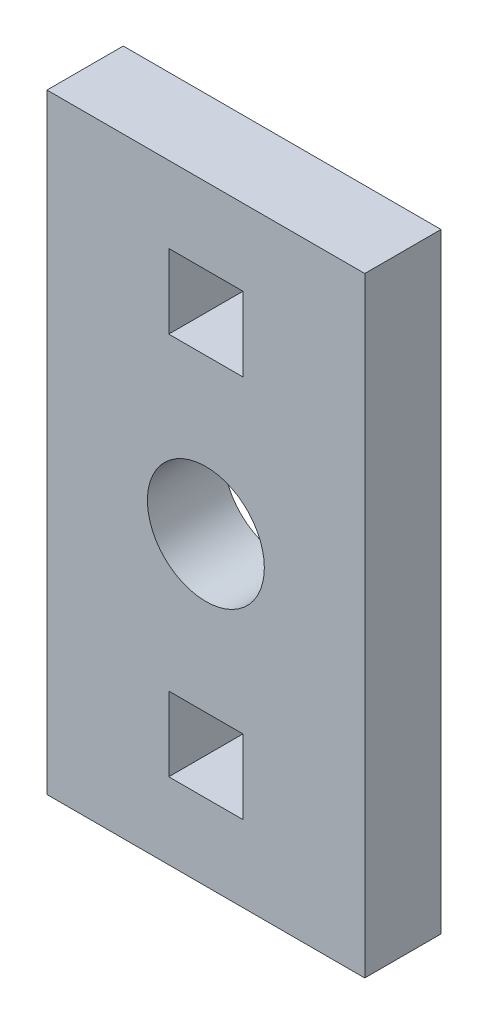
ISO-10303-21;
HEADER;
FILE_DESCRIPTION(('STEP AP214'),'2;1');
FILE_NAME('part.step','',(''),(''),'','','');
FILE_SCHEMA(('AUTOMOTIVE_DESIGN { 1 0 10303 214 1 1 1 1 }'));
ENDSEC;
DATA;
#1=APPLICATION_CONTEXT('core data for automotive mechanical design processes');
#2=APPLICATION_PROTOCOL_DEFINITION('international standard','automotive_design',2000,#1);
#3=PRODUCT_CONTEXT('',#1,'mechanical');
#4=PRODUCT('Part','Part','',(#3));
#5=PRODUCT_RELATED_PRODUCT_CATEGORY('part','',(#4));
#6=PRODUCT_DEFINITION_FORMATION('','',#4);
#7=PRODUCT_DEFINITION_CONTEXT('part definition',#1,'design');
#8=PRODUCT_DEFINITION('design','',#6,#7);
#9=PRODUCT_DEFINITION_SHAPE('','',#8);
#10=(LENGTH_UNIT() NAMED_UNIT(*) SI_UNIT(.MILLI.,.METRE.));
#11=(NAMED_UNIT(*) PLANE_ANGLE_UNIT() SI_UNIT($,.RADIAN.));
#12=(NAMED_UNIT(*) SI_UNIT($,.STERADIAN.) SOLID_ANGLE_UNIT());
#13=UNCERTAINTY_MEASURE_WITH_UNIT(LENGTH_MEASURE(1.E-05),#10,'distance_accuracy_value','');
#14=(GEOMETRIC_REPRESENTATION_CONTEXT(3) GLOBAL_UNCERTAINTY_ASSIGNED_CONTEXT((#13)) GLOBAL_UNIT_ASSIGNED_CONTEXT((#10,
#11,#12)) REPRESENTATION_CONTEXT('',''));
#15=CARTESIAN_POINT('',(0.,0.,0.));
#16=DIRECTION('',(0.,0.,1.));
#17=DIRECTION('',(1.,0.,0.));
#18=AXIS2_PLACEMENT_3D('',#15,#16,#17);
#19=CARTESIAN_POINT('',(0.,0.,3.));
#20=DIRECTION('',(0.,0.,1.));
#21=DIRECTION('',(1.,0.,0.));
#22=AXIS2_PLACEMENT_3D('',#19,#20,#21);
#23=PLANE('',#22);
#24=DIRECTION('',(0.,-1.,0.));
#25=VECTOR('',#24,1.);
#26=CARTESIAN_POINT('',(-10.4166666666667,7.90441176470589,3.));
#27=LINE('',#26,#25);
#28=CARTESIAN_POINT('',(-10.4166666666667,7.90441176470589,3.));
#29=VERTEX_POINT('',#28);
#30=CARTESIAN_POINT('',(-10.4166666666667,-16.0955882352941,3.));
#31=VERTEX_POINT('',#30);
#32=EDGE_CURVE('E194',#29,#31,#27,.T.);
#33=ORIENTED_EDGE('',*,*,#32,.T.);
#34=DIRECTION('',(1.,0.,0.));
#35=VECTOR('',#34,1.);
#36=CARTESIAN_POINT('',(-10.4166666666667,-16.0955882352941,3.));
#37=LINE('',#36,#35);
#38=CARTESIAN_POINT('',(2.08333333333333,-16.0955882352941,3.));
#39=VERTEX_POINT('',#38);
#40=EDGE_CURVE('E197',#31,#39,#37,.T.);
#41=ORIENTED_EDGE('',*,*,#40,.T.);
#42=DIRECTION('',(0.,1.,0.));
#43=VECTOR('',#42,1.);
#44=CARTESIAN_POINT('',(2.08333333333333,7.90441176470589,3.));
#45=LINE('',#44,#43);
#46=CARTESIAN_POINT('',(2.08333333333333,7.90441176470589,3.));
#47=VERTEX_POINT('',#46);
#48=EDGE_CURVE('E200',#39,#47,#45,.T.);
#49=ORIENTED_EDGE('',*,*,#48,.T.);
#50=DIRECTION('',(-1.,0.,0.));
#51=VECTOR('',#50,1.);
#52=CARTESIAN_POINT('',(-10.4166666666667,7.90441176470589,3.));
#53=LINE('',#52,#51);
#54=EDGE_CURVE('E202',#47,#29,#53,.T.);
#55=ORIENTED_EDGE('',*,*,#54,.T.);
#56=EDGE_LOOP('',(#33,#41,#49,#55));
#57=FACE_BOUND('',#56,.T.);
#58=CARTESIAN_POINT('',(-4.16666666666667,-4.09558823529412,3.));
#59=DIRECTION('',(0.,0.,1.));
#60=DIRECTION('',(1.,0.,0.));
#61=AXIS2_PLACEMENT_3D('',#58,#59,#60);
#62=CIRCLE('',#61,2.3);
#63=CARTESIAN_POINT('',(-1.86666666666667,-4.09558823529412,3.));
#64=VERTEX_POINT('',#63);
#65=EDGE_CURVE('E188',#64,#64,#62,.T.);
#66=ORIENTED_EDGE('',*,*,#65,.F.);
#67=EDGE_LOOP('',(#66));
#68=FACE_BOUND('',#67,.T.);
#69=DIRECTION('',(1.,0.,0.));
#70=VECTOR('',#69,1.);
#71=CARTESIAN_POINT('',(-5.62666666666667,1.98441176470589,3.));
#72=LINE('',#71,#70);
#73=CARTESIAN_POINT('',(-5.62666666666667,1.98441176470589,3.));
#74=VERTEX_POINT('',#73);
#75=CARTESIAN_POINT('',(-2.70666666666667,1.98441176470589,3.));
#76=VERTEX_POINT('',#75);
#77=EDGE_CURVE('E159',#74,#76,#72,.T.);
#78=ORIENTED_EDGE('',*,*,#77,.F.);
#79=DIRECTION('',(0.,-1.,0.));
#80=VECTOR('',#79,1.);
#81=CARTESIAN_POINT('',(-5.62666666666667,4.90441176470589,3.));
#82=LINE('',#81,#80);
#83=CARTESIAN_POINT('',(-5.62666666666667,4.90441176470589,3.));
#84=VERTEX_POINT('',#83);
#85=EDGE_CURVE('E157',#84,#74,#82,.T.);
#86=ORIENTED_EDGE('',*,*,#85,.F.);
#87=DIRECTION('',(-1.,0.,0.));
#88=VECTOR('',#87,1.);
#89=CARTESIAN_POINT('',(-5.62666666666667,4.90441176470589,3.));
#90=LINE('',#89,#88);
#91=CARTESIAN_POINT('',(-2.70666666666667,4.90441176470589,3.));
#92=VERTEX_POINT('',#91);
#93=EDGE_CURVE('E165',#92,#84,#90,.T.);
#94=ORIENTED_EDGE('',*,*,#93,.F.);
#95=DIRECTION('',(0.,1.,0.));
#96=VECTOR('',#95,1.);
#97=CARTESIAN_POINT('',(-2.70666666666667,4.90441176470589,3.));
#98=LINE('',#97,#96);
#99=EDGE_CURVE('E162',#76,#92,#98,.T.);
#100=ORIENTED_EDGE('',*,*,#99,.F.);
#101=EDGE_LOOP('',(#78,#86,#94,#100));
#102=FACE_BOUND('',#101,.T.);
#103=DIRECTION('',(0.,1.,0.));
#104=VECTOR('',#103,1.);
#105=CARTESIAN_POINT('',(-2.70666666666667,-13.0955882352941,3.));
#106=LINE('',#105,#104);
#107=CARTESIAN_POINT('',(-2.70666666666667,-13.0955882352941,3.));
#108=VERTEX_POINT('',#107);
#109=CARTESIAN_POINT('',(-2.70666666666667,-10.1755882352941,3.));
#110=VERTEX_POINT('',#109);
#111=EDGE_CURVE('E129',#108,#110,#106,.T.);
#112=ORIENTED_EDGE('',*,*,#111,.F.);
#113=DIRECTION('',(1.,0.,0.));
#114=VECTOR('',#113,1.);
#115=CARTESIAN_POINT('',(-5.62666666666667,-13.0955882352941,3.));
#116=LINE('',#115,#114);
#117=CARTESIAN_POINT('',(-5.62666666666667,-13.0955882352941,3.));
#118=VERTEX_POINT('',#117);
#119=EDGE_CURVE('E121',#118,#108,#116,.T.);
#120=ORIENTED_EDGE('',*,*,#119,.F.);
#121=DIRECTION('',(0.,-1.,0.));
#122=VECTOR('',#121,1.);
#123=CARTESIAN_POINT('',(-5.62666666666667,-13.0955882352941,3.));
#124=LINE('',#123,#122);
#125=CARTESIAN_POINT('',(-5.62666666666667,-10.1755882352941,3.));
#126=VERTEX_POINT('',#125);
#127=EDGE_CURVE('E143',#126,#118,#124,.T.);
#128=ORIENTED_EDGE('',*,*,#127,.F.);
#129=DIRECTION('',(-1.,0.,0.));
#130=VECTOR('',#129,1.);
#131=CARTESIAN_POINT('',(-5.62666666666667,-10.1755882352941,3.));
#132=LINE('',#131,#130);
#133=EDGE_CURVE('E141',#110,#126,#132,.T.);
#134=ORIENTED_EDGE('',*,*,#133,.F.);
#135=EDGE_LOOP('',(#112,#120,#128,#134));
#136=FACE_BOUND('',#135,.T.);
#137=ADVANCED_FACE('F32',(#57,#68,#102,#136),#23,.T.);
#138=CARTESIAN_POINT('',(0.,0.,0.));
#139=DIRECTION('',(0.,0.,1.));
#140=DIRECTION('',(1.,0.,0.));
#141=AXIS2_PLACEMENT_3D('',#138,#139,#140);
#142=PLANE('',#141);
#143=DIRECTION('',(0.,-1.,0.));
#144=VECTOR('',#143,1.);
#145=CARTESIAN_POINT('',(-5.62666666666667,4.90441176470589,0.));
#146=LINE('',#145,#144);
#147=CARTESIAN_POINT('',(-5.62666666666667,4.90441176470589,0.));
#148=VERTEX_POINT('',#147);
#149=CARTESIAN_POINT('',(-5.62666666666667,1.98441176470589,0.));
#150=VERTEX_POINT('',#149);
#151=EDGE_CURVE('E137',#148,#150,#146,.T.);
#152=ORIENTED_EDGE('',*,*,#151,.T.);
#153=DIRECTION('',(1.,0.,0.));
#154=VECTOR('',#153,1.);
#155=CARTESIAN_POINT('',(-5.62666666666667,1.98441176470589,0.));
#156=LINE('',#155,#154);
#157=CARTESIAN_POINT('',(-2.70666666666667,1.98441176470589,0.));
#158=VERTEX_POINT('',#157);
#159=EDGE_CURVE('E170',#150,#158,#156,.T.);
#160=ORIENTED_EDGE('',*,*,#159,.T.);
#161=DIRECTION('',(0.,1.,0.));
#162=VECTOR('',#161,1.);
#163=CARTESIAN_POINT('',(-2.70666666666667,4.90441176470589,0.));
#164=LINE('',#163,#162);
#165=CARTESIAN_POINT('',(-2.70666666666667,4.90441176470589,0.));
#166=VERTEX_POINT('',#165);
#167=EDGE_CURVE('E173',#158,#166,#164,.T.);
#168=ORIENTED_EDGE('',*,*,#167,.T.);
#169=DIRECTION('',(-1.,0.,0.));
#170=VECTOR('',#169,1.);
#171=CARTESIAN_POINT('',(-5.62666666666667,4.90441176470589,0.));
#172=LINE('',#171,#170);
#173=EDGE_CURVE('E160',#166,#148,#172,.T.);
#174=ORIENTED_EDGE('',*,*,#173,.T.);
#175=EDGE_LOOP('',(#152,#160,#168,#174));
#176=FACE_BOUND('',#175,.T.);
#177=DIRECTION('',(0.,-1.,0.));
#178=VECTOR('',#177,1.);
#179=CARTESIAN_POINT('',(-10.4166666666667,7.90441176470589,0.));
#180=LINE('',#179,#178);
#181=CARTESIAN_POINT('',(-10.4166666666667,7.90441176470589,0.));
#182=VERTEX_POINT('',#181);
#183=CARTESIAN_POINT('',(-10.4166666666667,-16.0955882352941,0.));
#184=VERTEX_POINT('',#183);
#185=EDGE_CURVE('E191',#182,#184,#180,.T.);
#186=ORIENTED_EDGE('',*,*,#185,.F.);
#187=DIRECTION('',(-1.,0.,0.));
#188=VECTOR('',#187,1.);
#189=CARTESIAN_POINT('',(-10.4166666666667,7.90441176470589,0.));
#190=LINE('',#189,#188);
#191=CARTESIAN_POINT('',(2.08333333333333,7.90441176470589,0.));
#192=VERTEX_POINT('',#191);
#193=EDGE_CURVE('E198',#192,#182,#190,.T.);
#194=ORIENTED_EDGE('',*,*,#193,.F.);
#195=DIRECTION('',(0.,1.,0.));
#196=VECTOR('',#195,1.);
#197=CARTESIAN_POINT('',(2.08333333333333,7.90441176470589,0.));
#198=LINE('',#197,#196);
#199=CARTESIAN_POINT('',(2.08333333333333,-16.0955882352941,0.));
#200=VERTEX_POINT('',#199);
#201=EDGE_CURVE('E209',#200,#192,#198,.T.);
#202=ORIENTED_EDGE('',*,*,#201,.F.);
#203=DIRECTION('',(1.,0.,0.));
#204=VECTOR('',#203,1.);
#205=CARTESIAN_POINT('',(-10.4166666666667,-16.0955882352941,0.));
#206=LINE('',#205,#204);
#207=EDGE_CURVE('E207',#184,#200,#206,.T.);
#208=ORIENTED_EDGE('',*,*,#207,.F.);
#209=EDGE_LOOP('',(#186,#194,#202,#208));
#210=FACE_BOUND('',#209,.T.);
#211=CARTESIAN_POINT('',(-4.16666666666667,-4.09558823529412,0.));
#212=DIRECTION('',(0.,0.,1.));
#213=DIRECTION('',(1.,0.,0.));
#214=AXIS2_PLACEMENT_3D('',#211,#212,#213);
#215=CIRCLE('',#214,2.3);
#216=CARTESIAN_POINT('',(-1.86666666666667,-4.09558823529412,0.));
#217=VERTEX_POINT('',#216);
#218=EDGE_CURVE('E187',#217,#217,#215,.T.);
#219=ORIENTED_EDGE('',*,*,#218,.T.);
#220=EDGE_LOOP('',(#219));
#221=FACE_BOUND('',#220,.T.);
#222=DIRECTION('',(1.,0.,0.));
#223=VECTOR('',#222,1.);
#224=CARTESIAN_POINT('',(-5.62666666666667,-13.0955882352941,0.));
#225=LINE('',#224,#223);
#226=CARTESIAN_POINT('',(-5.62666666666667,-13.0955882352941,0.));
#227=VERTEX_POINT('',#226);
#228=CARTESIAN_POINT('',(-2.70666666666667,-13.0955882352941,0.));
#229=VERTEX_POINT('',#228);
#230=EDGE_CURVE('E55',#227,#229,#225,.T.);
#231=ORIENTED_EDGE('',*,*,#230,.T.);
#232=DIRECTION('',(0.,1.,0.));
#233=VECTOR('',#232,1.);
#234=CARTESIAN_POINT('',(-2.70666666666667,-13.0955882352941,0.));
#235=LINE('',#234,#233);
#236=CARTESIAN_POINT('',(-2.70666666666667,-10.1755882352941,0.));
#237=VERTEX_POINT('',#236);
#238=EDGE_CURVE('E136',#229,#237,#235,.T.);
#239=ORIENTED_EDGE('',*,*,#238,.T.);
#240=DIRECTION('',(-1.,0.,0.));
#241=VECTOR('',#240,1.);
#242=CARTESIAN_POINT('',(-5.62666666666667,-10.1755882352941,0.));
#243=LINE('',#242,#241);
#244=CARTESIAN_POINT('',(-5.62666666666667,-10.1755882352941,0.));
#245=VERTEX_POINT('',#244);
#246=EDGE_CURVE('E149',#237,#245,#243,.T.);
#247=ORIENTED_EDGE('',*,*,#246,.T.);
#248=DIRECTION('',(0.,-1.,0.));
#249=VECTOR('',#248,1.);
#250=CARTESIAN_POINT('',(-5.62666666666667,-13.0955882352941,0.));
#251=LINE('',#250,#249);
#252=EDGE_CURVE('E130',#245,#227,#251,.T.);
#253=ORIENTED_EDGE('',*,*,#252,.T.);
#254=EDGE_LOOP('',(#231,#239,#247,#253));
#255=FACE_BOUND('',#254,.T.);
#256=ADVANCED_FACE('F227',(#176,#210,#221,#255),#142,.F.);
#257=CARTESIAN_POINT('',(-10.4166666666667,7.90441176470589,3.));
#258=DIRECTION('',(1.,0.,0.));
#259=DIRECTION('',(0.,1.,0.));
#260=AXIS2_PLACEMENT_3D('',#257,#258,#259);
#261=PLANE('',#260);
#262=ORIENTED_EDGE('',*,*,#185,.T.);
#263=DIRECTION('',(0.,0.,-1.));
#264=VECTOR('',#263,1.);
#265=CARTESIAN_POINT('',(-10.4166666666667,-16.0955882352941,3.));
#266=LINE('',#265,#264);
#267=EDGE_CURVE('E11',#31,#184,#266,.T.);
#268=ORIENTED_EDGE('',*,*,#267,.F.);
#269=ORIENTED_EDGE('',*,*,#32,.F.);
#270=DIRECTION('',(0.,0.,-1.));
#271=VECTOR('',#270,1.);
#272=CARTESIAN_POINT('',(-10.4166666666667,7.90441176470589,3.));
#273=LINE('',#272,#271);
#274=EDGE_CURVE('E204',#29,#182,#273,.T.);
#275=ORIENTED_EDGE('',*,*,#274,.T.);
#276=EDGE_LOOP('',(#262,#268,#269,#275));
#277=FACE_BOUND('',#276,.T.);
#278=ADVANCED_FACE('F34',(#277),#261,.F.);
#279=CARTESIAN_POINT('',(-10.4166666666667,-16.0955882352941,3.));
#280=DIRECTION('',(0.,1.,0.));
#281=DIRECTION('',(0.,0.,1.));
#282=AXIS2_PLACEMENT_3D('',#279,#280,#281);
#283=PLANE('',#282);
#284=ORIENTED_EDGE('',*,*,#207,.T.);
#285=DIRECTION('',(0.,0.,-1.));
#286=VECTOR('',#285,1.);
#287=CARTESIAN_POINT('',(2.08333333333333,-16.0955882352941,3.));
#288=LINE('',#287,#286);
#289=EDGE_CURVE('E40',#39,#200,#288,.T.);
#290=ORIENTED_EDGE('',*,*,#289,.F.);
#291=ORIENTED_EDGE('',*,*,#40,.F.);
#292=ORIENTED_EDGE('',*,*,#267,.T.);
#293=EDGE_LOOP('',(#284,#290,#291,#292));
#294=FACE_BOUND('',#293,.T.);
#295=ADVANCED_FACE('F238',(#294),#283,.F.);
#296=CARTESIAN_POINT('',(2.08333333333333,7.90441176470589,3.));
#297=DIRECTION('',(-1.,0.,0.));
#298=DIRECTION('',(0.,-1.,0.));
#299=AXIS2_PLACEMENT_3D('',#296,#297,#298);
#300=PLANE('',#299);
#301=ORIENTED_EDGE('',*,*,#201,.T.);
#302=DIRECTION('',(0.,0.,-1.));
#303=VECTOR('',#302,1.);
#304=CARTESIAN_POINT('',(2.08333333333333,7.90441176470589,3.));
#305=LINE('',#304,#303);
#306=EDGE_CURVE('E214',#47,#192,#305,.T.);
#307=ORIENTED_EDGE('',*,*,#306,.F.);
#308=ORIENTED_EDGE('',*,*,#48,.F.);
#309=ORIENTED_EDGE('',*,*,#289,.T.);
#310=EDGE_LOOP('',(#301,#307,#308,#309));
#311=FACE_BOUND('',#310,.T.);
#312=ADVANCED_FACE('F221',(#311),#300,.F.);
#313=CARTESIAN_POINT('',(-10.4166666666667,7.90441176470589,3.));
#314=DIRECTION('',(0.,-1.,0.));
#315=DIRECTION('',(0.,0.,-1.));
#316=AXIS2_PLACEMENT_3D('',#313,#314,#315);
#317=PLANE('',#316);
#318=ORIENTED_EDGE('',*,*,#193,.T.);
#319=ORIENTED_EDGE('',*,*,#274,.F.);
#320=ORIENTED_EDGE('',*,*,#54,.F.);
#321=ORIENTED_EDGE('',*,*,#306,.T.);
#322=EDGE_LOOP('',(#318,#319,#320,#321));
#323=FACE_BOUND('',#322,.T.);
#324=ADVANCED_FACE('F231',(#323),#317,.F.);
#325=CARTESIAN_POINT('',(-4.16666666666667,-4.09558823529412,3.));
#326=DIRECTION('',(0.,0.,-1.));
#327=DIRECTION('',(-1.,0.,0.));
#328=AXIS2_PLACEMENT_3D('',#325,#326,#327);
#329=CYLINDRICAL_SURFACE('',#328,2.3);
#330=ORIENTED_EDGE('',*,*,#65,.T.);
#331=EDGE_LOOP('',(#330));
#332=FACE_BOUND('',#331,.T.);
#333=ORIENTED_EDGE('',*,*,#218,.F.);
#334=EDGE_LOOP('',(#333));
#335=FACE_BOUND('',#334,.T.);
#336=ADVANCED_FACE('F253',(#332,#335),#329,.F.);
#337=CARTESIAN_POINT('',(-5.62666666666667,4.90441176470589,3.));
#338=DIRECTION('',(1.,0.,0.));
#339=DIRECTION('',(0.,1.,0.));
#340=AXIS2_PLACEMENT_3D('',#337,#338,#339);
#341=PLANE('',#340);
#342=ORIENTED_EDGE('',*,*,#151,.F.);
#343=DIRECTION('',(0.,0.,-1.));
#344=VECTOR('',#343,1.);
#345=CARTESIAN_POINT('',(-5.62666666666667,4.90441176470589,3.));
#346=LINE('',#345,#344);
#347=EDGE_CURVE('E167',#84,#148,#346,.T.);
#348=ORIENTED_EDGE('',*,*,#347,.F.);
#349=ORIENTED_EDGE('',*,*,#85,.T.);
#350=DIRECTION('',(0.,0.,-1.));
#351=VECTOR('',#350,1.);
#352=CARTESIAN_POINT('',(-5.62666666666667,1.98441176470589,3.));
#353=LINE('',#352,#351);
#354=EDGE_CURVE('E184',#74,#150,#353,.T.);
#355=ORIENTED_EDGE('',*,*,#354,.T.);
#356=EDGE_LOOP('',(#342,#348,#349,#355));
#357=FACE_BOUND('',#356,.T.);
#358=ADVANCED_FACE('F260',(#357),#341,.T.);
#359=CARTESIAN_POINT('',(-5.62666666666667,1.98441176470589,3.));
#360=DIRECTION('',(0.,1.,0.));
#361=DIRECTION('',(0.,0.,1.));
#362=AXIS2_PLACEMENT_3D('',#359,#360,#361);
#363=PLANE('',#362);
#364=ORIENTED_EDGE('',*,*,#159,.F.);
#365=ORIENTED_EDGE('',*,*,#354,.F.);
#366=ORIENTED_EDGE('',*,*,#77,.T.);
#367=DIRECTION('',(0.,0.,-1.));
#368=VECTOR('',#367,1.);
#369=CARTESIAN_POINT('',(-2.70666666666667,1.98441176470589,3.));
#370=LINE('',#369,#368);
#371=EDGE_CURVE('E182',#76,#158,#370,.T.);
#372=ORIENTED_EDGE('',*,*,#371,.T.);
#373=EDGE_LOOP('',(#364,#365,#366,#372));
#374=FACE_BOUND('',#373,.T.);
#375=ADVANCED_FACE('F265',(#374),#363,.T.);
#376=CARTESIAN_POINT('',(-2.70666666666667,4.90441176470589,3.));
#377=DIRECTION('',(-1.,0.,0.));
#378=DIRECTION('',(0.,-1.,0.));
#379=AXIS2_PLACEMENT_3D('',#376,#377,#378);
#380=PLANE('',#379);
#381=ORIENTED_EDGE('',*,*,#167,.F.);
#382=ORIENTED_EDGE('',*,*,#371,.F.);
#383=ORIENTED_EDGE('',*,*,#99,.T.);
#384=DIRECTION('',(0.,0.,-1.));
#385=VECTOR('',#384,1.);
#386=CARTESIAN_POINT('',(-2.70666666666667,4.90441176470589,3.));
#387=LINE('',#386,#385);
#388=EDGE_CURVE('E180',#92,#166,#387,.T.);
#389=ORIENTED_EDGE('',*,*,#388,.T.);
#390=EDGE_LOOP('',(#381,#382,#383,#389));
#391=FACE_BOUND('',#390,.T.);
#392=ADVANCED_FACE('F289',(#391),#380,.T.);
#393=CARTESIAN_POINT('',(-5.62666666666667,4.90441176470589,3.));
#394=DIRECTION('',(0.,-1.,0.));
#395=DIRECTION('',(0.,0.,-1.));
#396=AXIS2_PLACEMENT_3D('',#393,#394,#395);
#397=PLANE('',#396);
#398=ORIENTED_EDGE('',*,*,#173,.F.);
#399=ORIENTED_EDGE('',*,*,#388,.F.);
#400=ORIENTED_EDGE('',*,*,#93,.T.);
#401=ORIENTED_EDGE('',*,*,#347,.T.);
#402=EDGE_LOOP('',(#398,#399,#400,#401));
#403=FACE_BOUND('',#402,.T.);
#404=ADVANCED_FACE('F286',(#403),#397,.T.);
#405=CARTESIAN_POINT('',(-5.62666666666667,-13.0955882352941,3.));
#406=DIRECTION('',(0.,1.,0.));
#407=DIRECTION('',(0.,0.,1.));
#408=AXIS2_PLACEMENT_3D('',#405,#406,#407);
#409=PLANE('',#408);
#410=ORIENTED_EDGE('',*,*,#230,.F.);
#411=DIRECTION('',(0.,0.,-1.));
#412=VECTOR('',#411,1.);
#413=CARTESIAN_POINT('',(-5.62666666666667,-13.0955882352941,3.));
#414=LINE('',#413,#412);
#415=EDGE_CURVE('E125',#118,#227,#414,.T.);
#416=ORIENTED_EDGE('',*,*,#415,.F.);
#417=ORIENTED_EDGE('',*,*,#119,.T.);
#418=DIRECTION('',(0.,0.,-1.));
#419=VECTOR('',#418,1.);
#420=CARTESIAN_POINT('',(-2.70666666666667,-13.0955882352941,3.));
#421=LINE('',#420,#419);
#422=EDGE_CURVE('E124',#108,#229,#421,.T.);
#423=ORIENTED_EDGE('',*,*,#422,.T.);
#424=EDGE_LOOP('',(#410,#416,#417,#423));
#425=FACE_BOUND('',#424,.T.);
#426=ADVANCED_FACE('F123',(#425),#409,.T.);
#427=CARTESIAN_POINT('',(-2.70666666666667,-13.0955882352941,3.));
#428=DIRECTION('',(-1.,0.,0.));
#429=DIRECTION('',(0.,-1.,0.));
#430=AXIS2_PLACEMENT_3D('',#427,#428,#429);
#431=PLANE('',#430);
#432=ORIENTED_EDGE('',*,*,#238,.F.);
#433=ORIENTED_EDGE('',*,*,#422,.F.);
#434=ORIENTED_EDGE('',*,*,#111,.T.);
#435=DIRECTION('',(0.,0.,-1.));
#436=VECTOR('',#435,1.);
#437=CARTESIAN_POINT('',(-2.70666666666667,-10.1755882352941,3.));
#438=LINE('',#437,#436);
#439=EDGE_CURVE('E138',#110,#237,#438,.T.);
#440=ORIENTED_EDGE('',*,*,#439,.T.);
#441=EDGE_LOOP('',(#432,#433,#434,#440));
#442=FACE_BOUND('',#441,.T.);
#443=ADVANCED_FACE('F133',(#442),#431,.T.);
#444=CARTESIAN_POINT('',(-5.62666666666667,-10.1755882352941,3.));
#445=DIRECTION('',(0.,-1.,0.));
#446=DIRECTION('',(0.,0.,-1.));
#447=AXIS2_PLACEMENT_3D('',#444,#445,#446);
#448=PLANE('',#447);
#449=ORIENTED_EDGE('',*,*,#246,.F.);
#450=ORIENTED_EDGE('',*,*,#439,.F.);
#451=ORIENTED_EDGE('',*,*,#133,.T.);
#452=DIRECTION('',(0.,0.,-1.));
#453=VECTOR('',#452,1.);
#454=CARTESIAN_POINT('',(-5.62666666666667,-10.1755882352941,3.));
#455=LINE('',#454,#453);
#456=EDGE_CURVE('E47',#126,#245,#455,.T.);
#457=ORIENTED_EDGE('',*,*,#456,.T.);
#458=EDGE_LOOP('',(#449,#450,#451,#457));
#459=FACE_BOUND('',#458,.T.);
#460=ADVANCED_FACE('F274',(#459),#448,.T.);
#461=CARTESIAN_POINT('',(-5.62666666666667,-13.0955882352941,3.));
#462=DIRECTION('',(1.,0.,0.));
#463=DIRECTION('',(0.,1.,0.));
#464=AXIS2_PLACEMENT_3D('',#461,#462,#463);
#465=PLANE('',#464);
#466=ORIENTED_EDGE('',*,*,#252,.F.);
#467=ORIENTED_EDGE('',*,*,#456,.F.);
#468=ORIENTED_EDGE('',*,*,#127,.T.);
#469=ORIENTED_EDGE('',*,*,#415,.T.);
#470=EDGE_LOOP('',(#466,#467,#468,#469));
#471=FACE_BOUND('',#470,.T.);
#472=ADVANCED_FACE('F272',(#471),#465,.T.);
#473=CLOSED_SHELL('',(#137,#256,#278,#295,#312,#324,#336,#358,#375,#392,#404,#426,#443,#460,#472));
#474=MANIFOLD_SOLID_BREP('B2',#473);
#475=ADVANCED_BREP_SHAPE_REPRESENTATION('',(#18,#474),#14);
#476=SHAPE_DEFINITION_REPRESENTATION(#9,#475);
ENDSEC;
END-ISO-10303-21;
